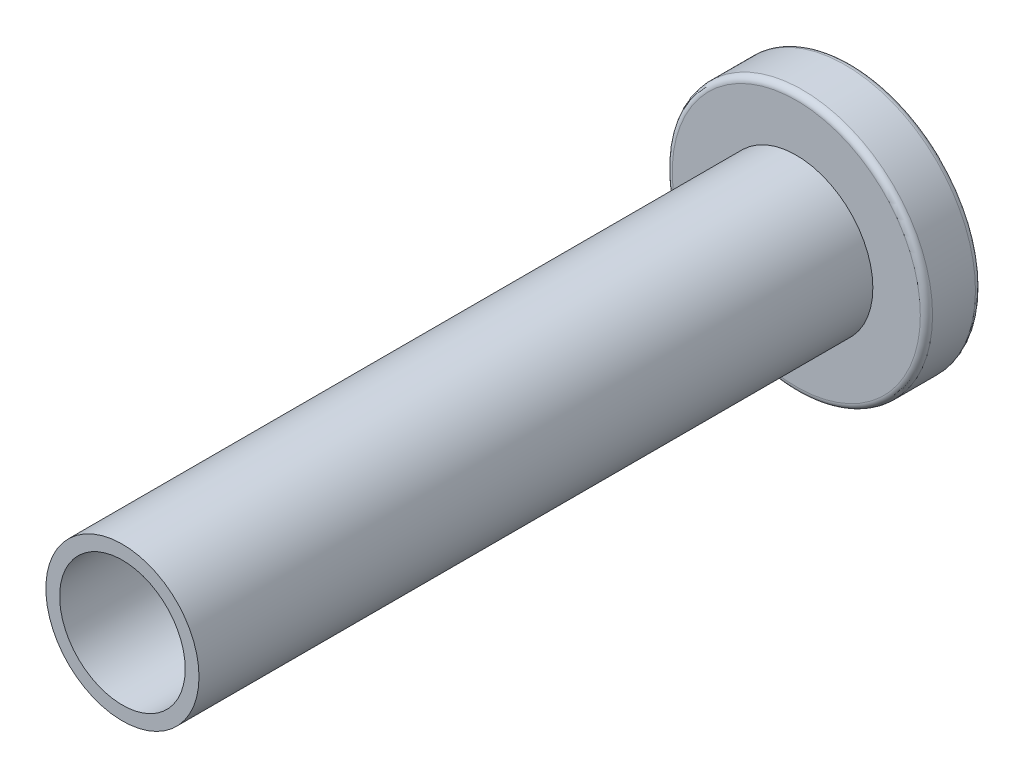
ISO-10303-21;
HEADER;
FILE_DESCRIPTION(('STEP AP214'),'2;1');
FILE_NAME('part.step','',(''),(''),'','','');
FILE_SCHEMA(('AUTOMOTIVE_DESIGN { 1 0 10303 214 1 1 1 1 }'));
ENDSEC;
DATA;
#1=APPLICATION_CONTEXT('core data for automotive mechanical design processes');
#2=APPLICATION_PROTOCOL_DEFINITION('international standard','automotive_design',2000,#1);
#3=PRODUCT_CONTEXT('',#1,'mechanical');
#4=PRODUCT('Part','Part','',(#3));
#5=PRODUCT_RELATED_PRODUCT_CATEGORY('part','',(#4));
#6=PRODUCT_DEFINITION_FORMATION('','',#4);
#7=PRODUCT_DEFINITION_CONTEXT('part definition',#1,'design');
#8=PRODUCT_DEFINITION('design','',#6,#7);
#9=PRODUCT_DEFINITION_SHAPE('','',#8);
#10=(LENGTH_UNIT() NAMED_UNIT(*) SI_UNIT(.MILLI.,.METRE.));
#11=(NAMED_UNIT(*) PLANE_ANGLE_UNIT() SI_UNIT($,.RADIAN.));
#12=(NAMED_UNIT(*) SI_UNIT($,.STERADIAN.) SOLID_ANGLE_UNIT());
#13=UNCERTAINTY_MEASURE_WITH_UNIT(LENGTH_MEASURE(1.E-05),#10,'distance_accuracy_value','');
#14=(GEOMETRIC_REPRESENTATION_CONTEXT(3) GLOBAL_UNCERTAINTY_ASSIGNED_CONTEXT((#13)) GLOBAL_UNIT_ASSIGNED_CONTEXT((#10,
#11,#12)) REPRESENTATION_CONTEXT('',''));
#15=CARTESIAN_POINT('',(0.,0.,0.));
#16=DIRECTION('',(0.,0.,1.));
#17=DIRECTION('',(1.,0.,0.));
#18=AXIS2_PLACEMENT_3D('',#15,#16,#17);
#19=CARTESIAN_POINT('',(0.,0.,1.8));
#20=DIRECTION('',(0.,0.,-1.));
#21=DIRECTION('',(-1.,0.,0.));
#22=AXIS2_PLACEMENT_3D('',#19,#20,#21);
#23=CYLINDRICAL_SURFACE('',#22,4.25);
#24=CARTESIAN_POINT('',(0.,0.,0.2));
#25=DIRECTION('',(0.,0.,1.));
#26=DIRECTION('',(1.,0.,0.));
#27=AXIS2_PLACEMENT_3D('',#24,#25,#26);
#28=CIRCLE('',#27,4.25);
#29=CARTESIAN_POINT('',(4.25,0.,0.2));
#30=VERTEX_POINT('',#29);
#31=EDGE_CURVE('E160',#30,#30,#28,.T.);
#32=ORIENTED_EDGE('',*,*,#31,.T.);
#33=EDGE_LOOP('',(#32));
#34=FACE_BOUND('',#33,.T.);
#35=CARTESIAN_POINT('',(0.,0.,1.6));
#36=DIRECTION('',(0.,0.,1.));
#37=DIRECTION('',(1.,0.,0.));
#38=AXIS2_PLACEMENT_3D('',#35,#36,#37);
#39=CIRCLE('',#38,4.25);
#40=CARTESIAN_POINT('',(4.25,0.,1.6));
#41=VERTEX_POINT('',#40);
#42=EDGE_CURVE('E157',#41,#41,#39,.F.);
#43=ORIENTED_EDGE('',*,*,#42,.T.);
#44=EDGE_LOOP('',(#43));
#45=FACE_BOUND('',#44,.T.);
#46=ADVANCED_FACE('F38',(#34,#45),#23,.T.);
#47=CARTESIAN_POINT('',(0.,0.,1.8));
#48=DIRECTION('',(0.,0.,1.));
#49=DIRECTION('',(1.,0.,0.));
#50=AXIS2_PLACEMENT_3D('',#47,#48,#49);
#51=PLANE('',#50);
#52=CARTESIAN_POINT('',(0.,0.,1.8));
#53=DIRECTION('',(0.,0.,1.));
#54=DIRECTION('',(1.,0.,0.));
#55=AXIS2_PLACEMENT_3D('',#52,#53,#54);
#56=CIRCLE('',#55,4.05);
#57=CARTESIAN_POINT('',(4.05,0.,1.8));
#58=VERTEX_POINT('',#57);
#59=EDGE_CURVE('E11',#58,#58,#56,.T.);
#60=ORIENTED_EDGE('',*,*,#59,.T.);
#61=EDGE_LOOP('',(#60));
#62=FACE_BOUND('',#61,.T.);
#63=CARTESIAN_POINT('',(0.,0.,1.8));
#64=DIRECTION('',(0.,0.,1.));
#65=DIRECTION('',(1.,0.,0.));
#66=AXIS2_PLACEMENT_3D('',#63,#64,#65);
#67=CIRCLE('',#66,2.5);
#68=CARTESIAN_POINT('',(2.5,0.,1.8));
#69=VERTEX_POINT('',#68);
#70=EDGE_CURVE('E148',#69,#69,#67,.T.);
#71=ORIENTED_EDGE('',*,*,#70,.F.);
#72=EDGE_LOOP('',(#71));
#73=FACE_BOUND('',#72,.T.);
#74=ADVANCED_FACE('F175',(#62,#73),#51,.T.);
#75=CARTESIAN_POINT('',(0.,0.,0.));
#76=DIRECTION('',(0.,0.,1.));
#77=DIRECTION('',(1.,0.,0.));
#78=AXIS2_PLACEMENT_3D('',#75,#76,#77);
#79=PLANE('',#78);
#80=DIRECTION('',(0.5,0.866025403784438,0.));
#81=VECTOR('',#80,1.);
#82=CARTESIAN_POINT('',(-1.44337567297407,0.,0.));
#83=LINE('',#82,#81);
#84=CARTESIAN_POINT('',(-1.44337567297407,0.,0.));
#85=VERTEX_POINT('',#84);
#86=CARTESIAN_POINT('',(-0.721687836487032,1.25,0.));
#87=VERTEX_POINT('',#86);
#88=EDGE_CURVE('E127',#85,#87,#83,.T.);
#89=ORIENTED_EDGE('',*,*,#88,.F.);
#90=DIRECTION('',(-0.5,0.866025403784438,0.));
#91=VECTOR('',#90,1.);
#92=CARTESIAN_POINT('',(-0.721687836487033,-1.25,0.));
#93=LINE('',#92,#91);
#94=CARTESIAN_POINT('',(-0.721687836487033,-1.25,0.));
#95=VERTEX_POINT('',#94);
#96=EDGE_CURVE('E53',#95,#85,#93,.T.);
#97=ORIENTED_EDGE('',*,*,#96,.F.);
#98=DIRECTION('',(-1.,0.,0.));
#99=VECTOR('',#98,1.);
#100=CARTESIAN_POINT('',(0.721687836487032,-1.25,0.));
#101=LINE('',#100,#99);
#102=CARTESIAN_POINT('',(0.721687836487032,-1.25,0.));
#103=VERTEX_POINT('',#102);
#104=EDGE_CURVE('E136',#103,#95,#101,.T.);
#105=ORIENTED_EDGE('',*,*,#104,.F.);
#106=DIRECTION('',(-0.5,-0.866025403784438,0.));
#107=VECTOR('',#106,1.);
#108=CARTESIAN_POINT('',(1.44337567297406,0.,0.));
#109=LINE('',#108,#107);
#110=CARTESIAN_POINT('',(1.44337567297406,0.,0.));
#111=VERTEX_POINT('',#110);
#112=EDGE_CURVE('E134',#111,#103,#109,.T.);
#113=ORIENTED_EDGE('',*,*,#112,.F.);
#114=DIRECTION('',(0.5,-0.866025403784438,0.));
#115=VECTOR('',#114,1.);
#116=CARTESIAN_POINT('',(0.721687836487032,1.25,0.));
#117=LINE('',#116,#115);
#118=CARTESIAN_POINT('',(0.721687836487032,1.25,0.));
#119=VERTEX_POINT('',#118);
#120=EDGE_CURVE('E101',#119,#111,#117,.T.);
#121=ORIENTED_EDGE('',*,*,#120,.F.);
#122=DIRECTION('',(1.,0.,0.));
#123=VECTOR('',#122,1.);
#124=CARTESIAN_POINT('',(-0.721687836487032,1.25,0.));
#125=LINE('',#124,#123);
#126=EDGE_CURVE('E130',#87,#119,#125,.T.);
#127=ORIENTED_EDGE('',*,*,#126,.F.);
#128=EDGE_LOOP('',(#89,#97,#105,#113,#121,#127));
#129=FACE_BOUND('',#128,.T.);
#130=CARTESIAN_POINT('',(0.,0.,0.));
#131=DIRECTION('',(0.,0.,1.));
#132=DIRECTION('',(1.,0.,0.));
#133=AXIS2_PLACEMENT_3D('',#130,#131,#132);
#134=CIRCLE('',#133,4.05);
#135=CARTESIAN_POINT('',(4.05,0.,0.));
#136=VERTEX_POINT('',#135);
#137=EDGE_CURVE('E46',#136,#136,#134,.F.);
#138=ORIENTED_EDGE('',*,*,#137,.T.);
#139=EDGE_LOOP('',(#138));
#140=FACE_BOUND('',#139,.T.);
#141=ADVANCED_FACE('F165',(#129,#140),#79,.F.);
#142=CARTESIAN_POINT('',(0.,0.,23.8));
#143=DIRECTION('',(0.,0.,1.));
#144=DIRECTION('',(1.,0.,0.));
#145=AXIS2_PLACEMENT_3D('',#142,#143,#144);
#146=PLANE('',#145);
#147=CARTESIAN_POINT('',(0.,0.,23.8));
#148=DIRECTION('',(0.,0.,1.));
#149=DIRECTION('',(1.,0.,0.));
#150=AXIS2_PLACEMENT_3D('',#147,#148,#149);
#151=CIRCLE('',#150,2.5);
#152=CARTESIAN_POINT('',(2.5,0.,23.8));
#153=VERTEX_POINT('',#152);
#154=EDGE_CURVE('E149',#153,#153,#151,.T.);
#155=ORIENTED_EDGE('',*,*,#154,.T.);
#156=EDGE_LOOP('',(#155));
#157=FACE_BOUND('',#156,.T.);
#158=CARTESIAN_POINT('',(0.,0.,23.8));
#159=DIRECTION('',(0.,0.,1.));
#160=DIRECTION('',(1.,0.,0.));
#161=AXIS2_PLACEMENT_3D('',#158,#159,#160);
#162=CIRCLE('',#161,2.05);
#163=CARTESIAN_POINT('',(2.05,0.,23.8));
#164=VERTEX_POINT('',#163);
#165=EDGE_CURVE('E140',#164,#164,#162,.T.);
#166=ORIENTED_EDGE('',*,*,#165,.F.);
#167=EDGE_LOOP('',(#166));
#168=FACE_BOUND('',#167,.T.);
#169=ADVANCED_FACE('F192',(#157,#168),#146,.T.);
#170=CARTESIAN_POINT('',(0.,0.,23.8));
#171=DIRECTION('',(0.,0.,-1.));
#172=DIRECTION('',(-1.,0.,0.));
#173=AXIS2_PLACEMENT_3D('',#170,#171,#172);
#174=CYLINDRICAL_SURFACE('',#173,2.5);
#175=ORIENTED_EDGE('',*,*,#154,.F.);
#176=EDGE_LOOP('',(#175));
#177=FACE_BOUND('',#176,.T.);
#178=ORIENTED_EDGE('',*,*,#70,.T.);
#179=EDGE_LOOP('',(#178));
#180=FACE_BOUND('',#179,.T.);
#181=ADVANCED_FACE('F189',(#177,#180),#174,.T.);
#182=CARTESIAN_POINT('',(0.,0.,23.8));
#183=DIRECTION('',(0.,0.,-1.));
#184=DIRECTION('',(-1.,0.,0.));
#185=AXIS2_PLACEMENT_3D('',#182,#183,#184);
#186=CYLINDRICAL_SURFACE('',#185,2.05);
#187=ORIENTED_EDGE('',*,*,#165,.T.);
#188=EDGE_LOOP('',(#187));
#189=FACE_BOUND('',#188,.T.);
#190=CARTESIAN_POINT('',(0.,0.,1.8));
#191=DIRECTION('',(0.,0.,1.));
#192=DIRECTION('',(1.,0.,0.));
#193=AXIS2_PLACEMENT_3D('',#190,#191,#192);
#194=CIRCLE('',#193,2.05);
#195=CARTESIAN_POINT('',(2.05,0.,1.8));
#196=VERTEX_POINT('',#195);
#197=EDGE_CURVE('E152',#196,#196,#194,.F.);
#198=ORIENTED_EDGE('',*,*,#197,.T.);
#199=EDGE_LOOP('',(#198));
#200=FACE_BOUND('',#199,.T.);
#201=ADVANCED_FACE('F191',(#189,#200),#186,.F.);
#202=ORIENTED_EDGE('',*,*,#197,.F.);
#203=EDGE_LOOP('',(#202));
#204=FACE_BOUND('',#203,.T.);
#205=ADVANCED_FACE('F170',(#204),#51,.T.);
#206=CARTESIAN_POINT('',(0.,0.,0.2));
#207=DIRECTION('',(0.,0.,1.));
#208=DIRECTION('',(1.,0.,0.));
#209=AXIS2_PLACEMENT_3D('',#206,#207,#208);
#210=TOROIDAL_SURFACE('',#209,4.05,0.2);
#211=ORIENTED_EDGE('',*,*,#137,.F.);
#212=EDGE_LOOP('',(#211));
#213=FACE_BOUND('',#212,.T.);
#214=ORIENTED_EDGE('',*,*,#31,.F.);
#215=EDGE_LOOP('',(#214));
#216=FACE_BOUND('',#215,.T.);
#217=ADVANCED_FACE('F167',(#213,#216),#210,.T.);
#218=CARTESIAN_POINT('',(0.,0.,1.6));
#219=DIRECTION('',(0.,0.,1.));
#220=DIRECTION('',(1.,0.,0.));
#221=AXIS2_PLACEMENT_3D('',#218,#219,#220);
#222=TOROIDAL_SURFACE('',#221,4.05,0.2);
#223=ORIENTED_EDGE('',*,*,#42,.F.);
#224=EDGE_LOOP('',(#223));
#225=FACE_BOUND('',#224,.T.);
#226=ORIENTED_EDGE('',*,*,#59,.F.);
#227=EDGE_LOOP('',(#226));
#228=FACE_BOUND('',#227,.T.);
#229=ADVANCED_FACE('F40',(#225,#228),#222,.T.);
#230=CARTESIAN_POINT('',(-0.721687836487033,-1.25,1.5));
#231=DIRECTION('',(-0.866025403784439,-0.5,0.));
#232=DIRECTION('',(0.5,-0.866025403784439,0.));
#233=AXIS2_PLACEMENT_3D('',#230,#231,#232);
#234=PLANE('',#233);
#235=ORIENTED_EDGE('',*,*,#96,.T.);
#236=DIRECTION('',(0.,0.,-1.));
#237=VECTOR('',#236,1.);
#238=CARTESIAN_POINT('',(-1.44337567297407,0.,1.5));
#239=LINE('',#238,#237);
#240=CARTESIAN_POINT('',(-1.44337567297407,0.,1.5));
#241=VERTEX_POINT('',#240);
#242=EDGE_CURVE('E83',#241,#85,#239,.T.);
#243=ORIENTED_EDGE('',*,*,#242,.F.);
#244=DIRECTION('',(-0.5,0.866025403784438,0.));
#245=VECTOR('',#244,1.);
#246=CARTESIAN_POINT('',(-0.721687836487033,-1.25,1.5));
#247=LINE('',#246,#245);
#248=CARTESIAN_POINT('',(-0.721687836487033,-1.25,1.5));
#249=VERTEX_POINT('',#248);
#250=EDGE_CURVE('E138',#249,#241,#247,.T.);
#251=ORIENTED_EDGE('',*,*,#250,.F.);
#252=DIRECTION('',(0.,0.,-1.));
#253=VECTOR('',#252,1.);
#254=CARTESIAN_POINT('',(-0.721687836487033,-1.25,1.5));
#255=LINE('',#254,#253);
#256=EDGE_CURVE('E61',#249,#95,#255,.T.);
#257=ORIENTED_EDGE('',*,*,#256,.T.);
#258=EDGE_LOOP('',(#235,#243,#251,#257));
#259=FACE_BOUND('',#258,.T.);
#260=ADVANCED_FACE('F181',(#259),#234,.F.);
#261=CARTESIAN_POINT('',(0.721687836487032,-1.25,1.5));
#262=DIRECTION('',(0.,-1.,0.));
#263=DIRECTION('',(1.,0.,0.));
#264=AXIS2_PLACEMENT_3D('',#261,#262,#263);
#265=PLANE('',#264);
#266=ORIENTED_EDGE('',*,*,#104,.T.);
#267=ORIENTED_EDGE('',*,*,#256,.F.);
#268=DIRECTION('',(-1.,0.,0.));
#269=VECTOR('',#268,1.);
#270=CARTESIAN_POINT('',(0.721687836487032,-1.25,1.5));
#271=LINE('',#270,#269);
#272=CARTESIAN_POINT('',(0.721687836487032,-1.25,1.5));
#273=VERTEX_POINT('',#272);
#274=EDGE_CURVE('E113',#273,#249,#271,.T.);
#275=ORIENTED_EDGE('',*,*,#274,.F.);
#276=DIRECTION('',(0.,0.,-1.));
#277=VECTOR('',#276,1.);
#278=CARTESIAN_POINT('',(0.721687836487032,-1.25,1.5));
#279=LINE('',#278,#277);
#280=EDGE_CURVE('E105',#273,#103,#279,.T.);
#281=ORIENTED_EDGE('',*,*,#280,.T.);
#282=EDGE_LOOP('',(#266,#267,#275,#281));
#283=FACE_BOUND('',#282,.T.);
#284=ADVANCED_FACE('F216',(#283),#265,.F.);
#285=CARTESIAN_POINT('',(1.44337567297406,0.,1.5));
#286=DIRECTION('',(0.866025403784439,-0.5,0.));
#287=DIRECTION('',(0.5,0.866025403784439,0.));
#288=AXIS2_PLACEMENT_3D('',#285,#286,#287);
#289=PLANE('',#288);
#290=ORIENTED_EDGE('',*,*,#112,.T.);
#291=ORIENTED_EDGE('',*,*,#280,.F.);
#292=DIRECTION('',(-0.5,-0.866025403784438,0.));
#293=VECTOR('',#292,1.);
#294=CARTESIAN_POINT('',(1.44337567297406,0.,1.5));
#295=LINE('',#294,#293);
#296=CARTESIAN_POINT('',(1.44337567297406,0.,1.5));
#297=VERTEX_POINT('',#296);
#298=EDGE_CURVE('E109',#297,#273,#295,.T.);
#299=ORIENTED_EDGE('',*,*,#298,.F.);
#300=DIRECTION('',(0.,0.,-1.));
#301=VECTOR('',#300,1.);
#302=CARTESIAN_POINT('',(1.44337567297406,0.,1.5));
#303=LINE('',#302,#301);
#304=EDGE_CURVE('E94',#297,#111,#303,.T.);
#305=ORIENTED_EDGE('',*,*,#304,.T.);
#306=EDGE_LOOP('',(#290,#291,#299,#305));
#307=FACE_BOUND('',#306,.T.);
#308=ADVANCED_FACE('F110',(#307),#289,.F.);
#309=CARTESIAN_POINT('',(0.721687836487032,1.25,1.5));
#310=DIRECTION('',(0.866025403784439,0.5,0.));
#311=DIRECTION('',(-0.5,0.866025403784439,0.));
#312=AXIS2_PLACEMENT_3D('',#309,#310,#311);
#313=PLANE('',#312);
#314=ORIENTED_EDGE('',*,*,#120,.T.);
#315=ORIENTED_EDGE('',*,*,#304,.F.);
#316=DIRECTION('',(0.5,-0.866025403784438,0.));
#317=VECTOR('',#316,1.);
#318=CARTESIAN_POINT('',(0.721687836487032,1.25,1.5));
#319=LINE('',#318,#317);
#320=CARTESIAN_POINT('',(0.721687836487032,1.25,1.5));
#321=VERTEX_POINT('',#320);
#322=EDGE_CURVE('E98',#321,#297,#319,.T.);
#323=ORIENTED_EDGE('',*,*,#322,.F.);
#324=DIRECTION('',(0.,0.,-1.));
#325=VECTOR('',#324,1.);
#326=CARTESIAN_POINT('',(0.721687836487032,1.25,1.5));
#327=LINE('',#326,#325);
#328=EDGE_CURVE('E106',#321,#119,#327,.T.);
#329=ORIENTED_EDGE('',*,*,#328,.T.);
#330=EDGE_LOOP('',(#314,#315,#323,#329));
#331=FACE_BOUND('',#330,.T.);
#332=ADVANCED_FACE('F96',(#331),#313,.F.);
#333=CARTESIAN_POINT('',(-0.721687836487032,1.25,1.5));
#334=DIRECTION('',(0.,1.,0.));
#335=DIRECTION('',(0.,0.,1.));
#336=AXIS2_PLACEMENT_3D('',#333,#334,#335);
#337=PLANE('',#336);
#338=ORIENTED_EDGE('',*,*,#126,.T.);
#339=ORIENTED_EDGE('',*,*,#328,.F.);
#340=DIRECTION('',(1.,0.,0.));
#341=VECTOR('',#340,1.);
#342=CARTESIAN_POINT('',(-0.721687836487032,1.25,1.5));
#343=LINE('',#342,#341);
#344=CARTESIAN_POINT('',(-0.721687836487032,1.25,1.5));
#345=VERTEX_POINT('',#344);
#346=EDGE_CURVE('E119',#345,#321,#343,.T.);
#347=ORIENTED_EDGE('',*,*,#346,.F.);
#348=DIRECTION('',(0.,0.,-1.));
#349=VECTOR('',#348,1.);
#350=CARTESIAN_POINT('',(-0.721687836487032,1.25,1.5));
#351=LINE('',#350,#349);
#352=EDGE_CURVE('E143',#345,#87,#351,.T.);
#353=ORIENTED_EDGE('',*,*,#352,.T.);
#354=EDGE_LOOP('',(#338,#339,#347,#353));
#355=FACE_BOUND('',#354,.T.);
#356=ADVANCED_FACE('F225',(#355),#337,.F.);
#357=CARTESIAN_POINT('',(-1.44337567297407,0.,1.5));
#358=DIRECTION('',(-0.866025403784438,0.5,0.));
#359=DIRECTION('',(-0.5,-0.866025403784438,0.));
#360=AXIS2_PLACEMENT_3D('',#357,#358,#359);
#361=PLANE('',#360);
#362=ORIENTED_EDGE('',*,*,#88,.T.);
#363=ORIENTED_EDGE('',*,*,#352,.F.);
#364=DIRECTION('',(0.5,0.866025403784438,0.));
#365=VECTOR('',#364,1.);
#366=CARTESIAN_POINT('',(-1.44337567297407,0.,1.5));
#367=LINE('',#366,#365);
#368=EDGE_CURVE('E121',#241,#345,#367,.T.);
#369=ORIENTED_EDGE('',*,*,#368,.F.);
#370=ORIENTED_EDGE('',*,*,#242,.T.);
#371=EDGE_LOOP('',(#362,#363,#369,#370));
#372=FACE_BOUND('',#371,.T.);
#373=ADVANCED_FACE('F213',(#372),#361,.F.);
#374=CARTESIAN_POINT('',(0.,0.,1.5));
#375=DIRECTION('',(0.,0.,-1.));
#376=DIRECTION('',(-1.,0.,0.));
#377=AXIS2_PLACEMENT_3D('',#374,#375,#376);
#378=PLANE('',#377);
#379=ORIENTED_EDGE('',*,*,#250,.T.);
#380=ORIENTED_EDGE('',*,*,#368,.T.);
#381=ORIENTED_EDGE('',*,*,#346,.T.);
#382=ORIENTED_EDGE('',*,*,#322,.T.);
#383=ORIENTED_EDGE('',*,*,#298,.T.);
#384=ORIENTED_EDGE('',*,*,#274,.T.);
#385=EDGE_LOOP('',(#379,#380,#381,#382,#383,#384));
#386=FACE_BOUND('',#385,.T.);
#387=ADVANCED_FACE('F116',(#386),#378,.T.);
#388=CLOSED_SHELL('',(#46,#74,#141,#169,#181,#201,#205,#217,#229,#260,#284,#308,#332,#356,#373,#387));
#389=MANIFOLD_SOLID_BREP('B2',#388);
#390=ADVANCED_BREP_SHAPE_REPRESENTATION('',(#18,#389),#14);
#391=SHAPE_DEFINITION_REPRESENTATION(#9,#390);
ENDSEC;
END-ISO-10303-21;
